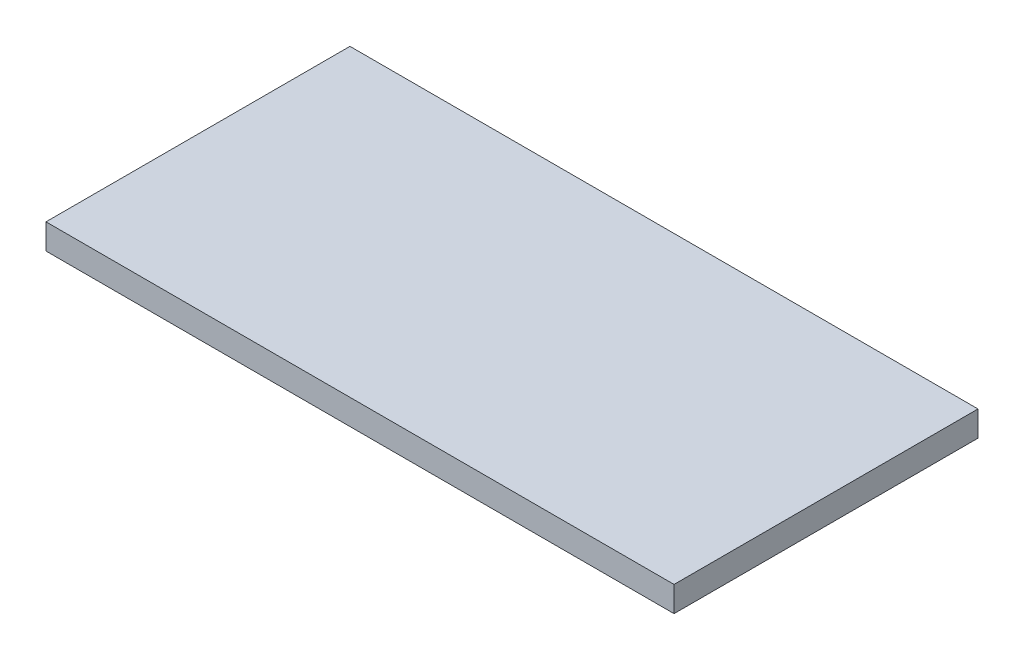
ISO-10303-21;
HEADER;
FILE_DESCRIPTION(('STEP AP214'),'2;1');
FILE_NAME('part.step','',(''),(''),'','','');
FILE_SCHEMA(('AUTOMOTIVE_DESIGN { 1 0 10303 214 1 1 1 1 }'));
ENDSEC;
DATA;
#1=APPLICATION_CONTEXT('core data for automotive mechanical design processes');
#2=APPLICATION_PROTOCOL_DEFINITION('international standard','automotive_design',2000,#1);
#3=PRODUCT_CONTEXT('',#1,'mechanical');
#4=PRODUCT('Part','Part','',(#3));
#5=PRODUCT_RELATED_PRODUCT_CATEGORY('part','',(#4));
#6=PRODUCT_DEFINITION_FORMATION('','',#4);
#7=PRODUCT_DEFINITION_CONTEXT('part definition',#1,'design');
#8=PRODUCT_DEFINITION('design','',#6,#7);
#9=PRODUCT_DEFINITION_SHAPE('','',#8);
#10=(LENGTH_UNIT() NAMED_UNIT(*) SI_UNIT(.MILLI.,.METRE.));
#11=(NAMED_UNIT(*) PLANE_ANGLE_UNIT() SI_UNIT($,.RADIAN.));
#12=(NAMED_UNIT(*) SI_UNIT($,.STERADIAN.) SOLID_ANGLE_UNIT());
#13=UNCERTAINTY_MEASURE_WITH_UNIT(LENGTH_MEASURE(1.E-05),#10,'distance_accuracy_value','');
#14=(GEOMETRIC_REPRESENTATION_CONTEXT(3) GLOBAL_UNCERTAINTY_ASSIGNED_CONTEXT((#13)) GLOBAL_UNIT_ASSIGNED_CONTEXT((#10,
#11,#12)) REPRESENTATION_CONTEXT('',''));
#15=CARTESIAN_POINT('',(0.,0.,0.));
#16=DIRECTION('',(0.,0.,1.));
#17=DIRECTION('',(1.,0.,0.));
#18=AXIS2_PLACEMENT_3D('',#15,#16,#17);
#19=CARTESIAN_POINT('',(0.,5.,0.));
#20=DIRECTION('',(1.,0.,0.));
#21=DIRECTION('',(0.,0.,-1.));
#22=AXIS2_PLACEMENT_3D('',#19,#20,#21);
#23=PLANE('',#22);
#24=DIRECTION('',(0.,0.,1.));
#25=VECTOR('',#24,1.);
#26=CARTESIAN_POINT('',(0.,0.,0.));
#27=LINE('',#26,#25);
#28=CARTESIAN_POINT('',(0.,0.,0.));
#29=VERTEX_POINT('',#28);
#30=CARTESIAN_POINT('',(0.,0.,60.01));
#31=VERTEX_POINT('',#30);
#32=EDGE_CURVE('E95',#29,#31,#27,.T.);
#33=ORIENTED_EDGE('',*,*,#32,.T.);
#34=DIRECTION('',(0.,-1.,0.));
#35=VECTOR('',#34,1.);
#36=CARTESIAN_POINT('',(0.,5.,60.01));
#37=LINE('',#36,#35);
#38=CARTESIAN_POINT('',(0.,5.,60.01));
#39=VERTEX_POINT('',#38);
#40=EDGE_CURVE('E11',#39,#31,#37,.T.);
#41=ORIENTED_EDGE('',*,*,#40,.F.);
#42=DIRECTION('',(0.,0.,1.));
#43=VECTOR('',#42,1.);
#44=CARTESIAN_POINT('',(0.,5.,0.));
#45=LINE('',#44,#43);
#46=CARTESIAN_POINT('',(0.,5.,0.));
#47=VERTEX_POINT('',#46);
#48=EDGE_CURVE('E83',#47,#39,#45,.T.);
#49=ORIENTED_EDGE('',*,*,#48,.F.);
#50=DIRECTION('',(0.,-1.,0.));
#51=VECTOR('',#50,1.);
#52=CARTESIAN_POINT('',(0.,5.,0.));
#53=LINE('',#52,#51);
#54=EDGE_CURVE('E91',#47,#29,#53,.T.);
#55=ORIENTED_EDGE('',*,*,#54,.T.);
#56=EDGE_LOOP('',(#33,#41,#49,#55));
#57=FACE_BOUND('',#56,.T.);
#58=ADVANCED_FACE('F32',(#57),#23,.F.);
#59=CARTESIAN_POINT('',(0.,5.,60.01));
#60=DIRECTION('',(0.,0.,-1.));
#61=DIRECTION('',(-1.,0.,0.));
#62=AXIS2_PLACEMENT_3D('',#59,#60,#61);
#63=PLANE('',#62);
#64=DIRECTION('',(1.,0.,0.));
#65=VECTOR('',#64,1.);
#66=CARTESIAN_POINT('',(0.,0.,60.01));
#67=LINE('',#66,#65);
#68=CARTESIAN_POINT('',(124.,0.,60.01));
#69=VERTEX_POINT('',#68);
#70=EDGE_CURVE('E87',#31,#69,#67,.T.);
#71=ORIENTED_EDGE('',*,*,#70,.T.);
#72=DIRECTION('',(0.,-1.,0.));
#73=VECTOR('',#72,1.);
#74=CARTESIAN_POINT('',(124.,5.,60.01));
#75=LINE('',#74,#73);
#76=CARTESIAN_POINT('',(124.,5.,60.01));
#77=VERTEX_POINT('',#76);
#78=EDGE_CURVE('E40',#77,#69,#75,.T.);
#79=ORIENTED_EDGE('',*,*,#78,.F.);
#80=DIRECTION('',(1.,0.,0.));
#81=VECTOR('',#80,1.);
#82=CARTESIAN_POINT('',(0.,5.,60.01));
#83=LINE('',#82,#81);
#84=EDGE_CURVE('E78',#39,#77,#83,.T.);
#85=ORIENTED_EDGE('',*,*,#84,.F.);
#86=ORIENTED_EDGE('',*,*,#40,.T.);
#87=EDGE_LOOP('',(#71,#79,#85,#86));
#88=FACE_BOUND('',#87,.T.);
#89=ADVANCED_FACE('F86',(#88),#63,.F.);
#90=CARTESIAN_POINT('',(124.,5.,0.));
#91=DIRECTION('',(-1.,0.,0.));
#92=DIRECTION('',(0.,0.,1.));
#93=AXIS2_PLACEMENT_3D('',#90,#91,#92);
#94=PLANE('',#93);
#95=DIRECTION('',(0.,0.,-1.));
#96=VECTOR('',#95,1.);
#97=CARTESIAN_POINT('',(124.,0.,0.));
#98=LINE('',#97,#96);
#99=CARTESIAN_POINT('',(124.,0.,0.));
#100=VERTEX_POINT('',#99);
#101=EDGE_CURVE('E65',#69,#100,#98,.T.);
#102=ORIENTED_EDGE('',*,*,#101,.T.);
#103=DIRECTION('',(0.,-1.,0.));
#104=VECTOR('',#103,1.);
#105=CARTESIAN_POINT('',(124.,5.,0.));
#106=LINE('',#105,#104);
#107=CARTESIAN_POINT('',(124.,5.,0.));
#108=VERTEX_POINT('',#107);
#109=EDGE_CURVE('E88',#108,#100,#106,.T.);
#110=ORIENTED_EDGE('',*,*,#109,.F.);
#111=DIRECTION('',(0.,0.,-1.));
#112=VECTOR('',#111,1.);
#113=CARTESIAN_POINT('',(124.,5.,0.));
#114=LINE('',#113,#112);
#115=EDGE_CURVE('E81',#77,#108,#114,.T.);
#116=ORIENTED_EDGE('',*,*,#115,.F.);
#117=ORIENTED_EDGE('',*,*,#78,.T.);
#118=EDGE_LOOP('',(#102,#110,#116,#117));
#119=FACE_BOUND('',#118,.T.);
#120=ADVANCED_FACE('F89',(#119),#94,.F.);
#121=CARTESIAN_POINT('',(0.,5.,0.));
#122=DIRECTION('',(0.,0.,1.));
#123=DIRECTION('',(1.,0.,0.));
#124=AXIS2_PLACEMENT_3D('',#121,#122,#123);
#125=PLANE('',#124);
#126=DIRECTION('',(-1.,0.,0.));
#127=VECTOR('',#126,1.);
#128=CARTESIAN_POINT('',(0.,0.,0.));
#129=LINE('',#128,#127);
#130=EDGE_CURVE('E71',#100,#29,#129,.T.);
#131=ORIENTED_EDGE('',*,*,#130,.T.);
#132=ORIENTED_EDGE('',*,*,#54,.F.);
#133=DIRECTION('',(-1.,0.,0.));
#134=VECTOR('',#133,1.);
#135=CARTESIAN_POINT('',(0.,5.,0.));
#136=LINE('',#135,#134);
#137=EDGE_CURVE('E48',#108,#47,#136,.T.);
#138=ORIENTED_EDGE('',*,*,#137,.F.);
#139=ORIENTED_EDGE('',*,*,#109,.T.);
#140=EDGE_LOOP('',(#131,#132,#138,#139));
#141=FACE_BOUND('',#140,.T.);
#142=ADVANCED_FACE('F102',(#141),#125,.F.);
#143=CARTESIAN_POINT('',(0.,5.,0.));
#144=DIRECTION('',(0.,1.,0.));
#145=DIRECTION('',(0.,0.,1.));
#146=AXIS2_PLACEMENT_3D('',#143,#144,#145);
#147=PLANE('',#146);
#148=ORIENTED_EDGE('',*,*,#48,.T.);
#149=ORIENTED_EDGE('',*,*,#84,.T.);
#150=ORIENTED_EDGE('',*,*,#115,.T.);
#151=ORIENTED_EDGE('',*,*,#137,.T.);
#152=EDGE_LOOP('',(#148,#149,#150,#151));
#153=FACE_BOUND('',#152,.T.);
#154=ADVANCED_FACE('F79',(#153),#147,.T.);
#155=CARTESIAN_POINT('',(0.,0.,0.));
#156=DIRECTION('',(0.,1.,0.));
#157=DIRECTION('',(0.,0.,1.));
#158=AXIS2_PLACEMENT_3D('',#155,#156,#157);
#159=PLANE('',#158);
#160=ORIENTED_EDGE('',*,*,#32,.F.);
#161=ORIENTED_EDGE('',*,*,#130,.F.);
#162=ORIENTED_EDGE('',*,*,#101,.F.);
#163=ORIENTED_EDGE('',*,*,#70,.F.);
#164=EDGE_LOOP('',(#160,#161,#162,#163));
#165=FACE_BOUND('',#164,.T.);
#166=ADVANCED_FACE('F105',(#165),#159,.F.);
#167=CLOSED_SHELL('',(#58,#89,#120,#142,#154,#166));
#168=MANIFOLD_SOLID_BREP('B2',#167);
#169=ADVANCED_BREP_SHAPE_REPRESENTATION('',(#18,#168),#14);
#170=SHAPE_DEFINITION_REPRESENTATION(#9,#169);
ENDSEC;
END-ISO-10303-21;
